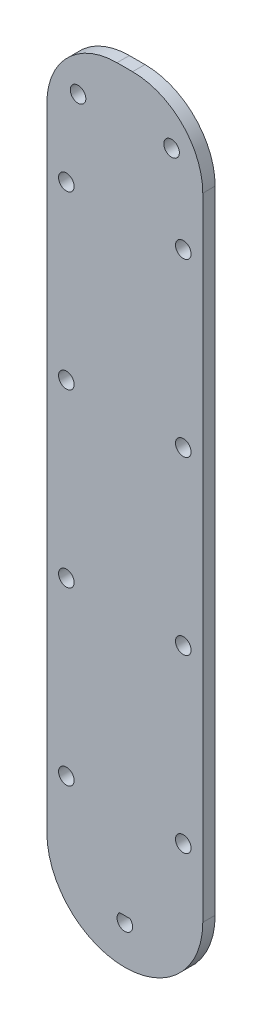
ISO-10303-21;
HEADER;
FILE_DESCRIPTION(('STEP AP214'),'2;1');
FILE_NAME('part.step','',(''),(''),'','','');
FILE_SCHEMA(('AUTOMOTIVE_DESIGN { 1 0 10303 214 1 1 1 1 }'));
ENDSEC;
DATA;
#1=APPLICATION_CONTEXT('core data for automotive mechanical design processes');
#2=APPLICATION_PROTOCOL_DEFINITION('international standard','automotive_design',2000,#1);
#3=PRODUCT_CONTEXT('',#1,'mechanical');
#4=PRODUCT('Part','Part','',(#3));
#5=PRODUCT_RELATED_PRODUCT_CATEGORY('part','',(#4));
#6=PRODUCT_DEFINITION_FORMATION('','',#4);
#7=PRODUCT_DEFINITION_CONTEXT('part definition',#1,'design');
#8=PRODUCT_DEFINITION('design','',#6,#7);
#9=PRODUCT_DEFINITION_SHAPE('','',#8);
#10=(LENGTH_UNIT() NAMED_UNIT(*) SI_UNIT(.MILLI.,.METRE.));
#11=(NAMED_UNIT(*) PLANE_ANGLE_UNIT() SI_UNIT($,.RADIAN.));
#12=(NAMED_UNIT(*) SI_UNIT($,.STERADIAN.) SOLID_ANGLE_UNIT());
#13=UNCERTAINTY_MEASURE_WITH_UNIT(LENGTH_MEASURE(1.E-05),#10,'distance_accuracy_value','');
#14=(GEOMETRIC_REPRESENTATION_CONTEXT(3) GLOBAL_UNCERTAINTY_ASSIGNED_CONTEXT((#13)) GLOBAL_UNIT_ASSIGNED_CONTEXT((#10,
#11,#12)) REPRESENTATION_CONTEXT('',''));
#15=CARTESIAN_POINT('',(0.,0.,0.));
#16=DIRECTION('',(0.,0.,1.));
#17=DIRECTION('',(1.,0.,0.));
#18=AXIS2_PLACEMENT_3D('',#15,#16,#17);
#19=CARTESIAN_POINT('',(20.,-100.,3.175));
#20=DIRECTION('',(-1.,0.,0.));
#21=DIRECTION('',(0.,0.,1.));
#22=AXIS2_PLACEMENT_3D('',#19,#20,#21);
#23=PLANE('',#22);
#24=DIRECTION('',(0.,1.,0.));
#25=VECTOR('',#24,1.);
#26=CARTESIAN_POINT('',(20.,-100.,0.));
#27=LINE('',#26,#25);
#28=CARTESIAN_POINT('',(20.,-80.,0.));
#29=VERTEX_POINT('',#28);
#30=CARTESIAN_POINT('',(20.,82.,0.));
#31=VERTEX_POINT('',#30);
#32=EDGE_CURVE('E142',#29,#31,#27,.T.);
#33=ORIENTED_EDGE('',*,*,#32,.T.);
#34=DIRECTION('',(0.,0.,-1.));
#35=VECTOR('',#34,1.);
#36=CARTESIAN_POINT('',(20.,82.,3.175));
#37=LINE('',#36,#35);
#38=CARTESIAN_POINT('',(20.,82.,3.175));
#39=VERTEX_POINT('',#38);
#40=EDGE_CURVE('E59',#31,#39,#37,.F.);
#41=ORIENTED_EDGE('',*,*,#40,.T.);
#42=DIRECTION('',(0.,1.,0.));
#43=VECTOR('',#42,1.);
#44=CARTESIAN_POINT('',(20.,-100.,3.175));
#45=LINE('',#44,#43);
#46=CARTESIAN_POINT('',(20.,-80.,3.175));
#47=VERTEX_POINT('',#46);
#48=EDGE_CURVE('E143',#47,#39,#45,.T.);
#49=ORIENTED_EDGE('',*,*,#48,.F.);
#50=DIRECTION('',(0.,0.,-1.));
#51=VECTOR('',#50,1.);
#52=CARTESIAN_POINT('',(20.,-80.,3.175));
#53=LINE('',#52,#51);
#54=EDGE_CURVE('E150',#47,#29,#53,.T.);
#55=ORIENTED_EDGE('',*,*,#54,.T.);
#56=EDGE_LOOP('',(#33,#41,#49,#55));
#57=FACE_BOUND('',#56,.T.);
#58=ADVANCED_FACE('F36',(#57),#23,.F.);
#59=CARTESIAN_POINT('',(-20.,100.,3.175));
#60=DIRECTION('',(0.,-1.,0.));
#61=DIRECTION('',(0.,0.,-1.));
#62=AXIS2_PLACEMENT_3D('',#59,#60,#61);
#63=PLANE('',#62);
#64=DIRECTION('',(-1.,0.,0.));
#65=VECTOR('',#64,1.);
#66=CARTESIAN_POINT('',(-20.,100.,3.175));
#67=LINE('',#66,#65);
#68=CARTESIAN_POINT('',(2.00000000000001,100.,3.175));
#69=VERTEX_POINT('',#68);
#70=CARTESIAN_POINT('',(-2.,100.,3.175));
#71=VERTEX_POINT('',#70);
#72=EDGE_CURVE('E145',#69,#71,#67,.T.);
#73=ORIENTED_EDGE('',*,*,#72,.F.);
#74=DIRECTION('',(0.,0.,-1.));
#75=VECTOR('',#74,1.);
#76=CARTESIAN_POINT('',(2.00000000000001,100.,3.175));
#77=LINE('',#76,#75);
#78=CARTESIAN_POINT('',(2.00000000000001,100.,0.));
#79=VERTEX_POINT('',#78);
#80=EDGE_CURVE('E172',#69,#79,#77,.T.);
#81=ORIENTED_EDGE('',*,*,#80,.T.);
#82=DIRECTION('',(-1.,0.,0.));
#83=VECTOR('',#82,1.);
#84=CARTESIAN_POINT('',(-20.,100.,0.));
#85=LINE('',#84,#83);
#86=CARTESIAN_POINT('',(-2.,100.,0.));
#87=VERTEX_POINT('',#86);
#88=EDGE_CURVE('E152',#79,#87,#85,.T.);
#89=ORIENTED_EDGE('',*,*,#88,.T.);
#90=DIRECTION('',(0.,0.,-1.));
#91=VECTOR('',#90,1.);
#92=CARTESIAN_POINT('',(-2.,100.,3.175));
#93=LINE('',#92,#91);
#94=EDGE_CURVE('E169',#87,#71,#93,.F.);
#95=ORIENTED_EDGE('',*,*,#94,.T.);
#96=EDGE_LOOP('',(#73,#81,#89,#95));
#97=FACE_BOUND('',#96,.T.);
#98=ADVANCED_FACE('F186',(#97),#63,.F.);
#99=CARTESIAN_POINT('',(-20.,-100.,3.175));
#100=DIRECTION('',(1.,0.,0.));
#101=DIRECTION('',(0.,0.,-1.));
#102=AXIS2_PLACEMENT_3D('',#99,#100,#101);
#103=PLANE('',#102);
#104=DIRECTION('',(0.,-1.,0.));
#105=VECTOR('',#104,1.);
#106=CARTESIAN_POINT('',(-20.,-100.,3.175));
#107=LINE('',#106,#105);
#108=CARTESIAN_POINT('',(-20.,82.,3.175));
#109=VERTEX_POINT('',#108);
#110=CARTESIAN_POINT('',(-20.,-80.,3.175));
#111=VERTEX_POINT('',#110);
#112=EDGE_CURVE('E148',#109,#111,#107,.T.);
#113=ORIENTED_EDGE('',*,*,#112,.F.);
#114=DIRECTION('',(0.,0.,-1.));
#115=VECTOR('',#114,1.);
#116=CARTESIAN_POINT('',(-20.,82.,3.175));
#117=LINE('',#116,#115);
#118=CARTESIAN_POINT('',(-20.,82.,0.));
#119=VERTEX_POINT('',#118);
#120=EDGE_CURVE('E11',#109,#119,#117,.T.);
#121=ORIENTED_EDGE('',*,*,#120,.T.);
#122=DIRECTION('',(0.,-1.,0.));
#123=VECTOR('',#122,1.);
#124=CARTESIAN_POINT('',(-20.,-100.,0.));
#125=LINE('',#124,#123);
#126=CARTESIAN_POINT('',(-20.,-80.,0.));
#127=VERTEX_POINT('',#126);
#128=EDGE_CURVE('E146',#119,#127,#125,.T.);
#129=ORIENTED_EDGE('',*,*,#128,.T.);
#130=DIRECTION('',(0.,0.,-1.));
#131=VECTOR('',#130,1.);
#132=CARTESIAN_POINT('',(-20.,-80.,3.175));
#133=LINE('',#132,#131);
#134=EDGE_CURVE('E167',#127,#111,#133,.F.);
#135=ORIENTED_EDGE('',*,*,#134,.T.);
#136=EDGE_LOOP('',(#113,#121,#129,#135));
#137=FACE_BOUND('',#136,.T.);
#138=ADVANCED_FACE('F203',(#137),#103,.F.);
#139=CARTESIAN_POINT('',(0.,0.,3.175));
#140=DIRECTION('',(0.,0.,-1.));
#141=DIRECTION('',(-1.,0.,0.));
#142=AXIS2_PLACEMENT_3D('',#139,#140,#141);
#143=PLANE('',#142);
#144=CARTESIAN_POINT('',(-12.,88.,3.175));
#145=DIRECTION('',(0.,0.,1.));
#146=DIRECTION('',(1.,0.,0.));
#147=AXIS2_PLACEMENT_3D('',#144,#145,#146);
#148=CIRCLE('',#147,2.);
#149=CARTESIAN_POINT('',(-10.,88.,3.175));
#150=VERTEX_POINT('',#149);
#151=EDGE_CURVE('E400',#150,#150,#148,.T.);
#152=ORIENTED_EDGE('',*,*,#151,.F.);
#153=EDGE_LOOP('',(#152));
#154=FACE_BOUND('',#153,.T.);
#155=CARTESIAN_POINT('',(12.,88.,3.175));
#156=DIRECTION('',(0.,0.,1.));
#157=DIRECTION('',(1.,0.,0.));
#158=AXIS2_PLACEMENT_3D('',#155,#156,#157);
#159=CIRCLE('',#158,2.);
#160=CARTESIAN_POINT('',(14.,88.,3.175));
#161=VERTEX_POINT('',#160);
#162=EDGE_CURVE('E406',#161,#161,#159,.T.);
#163=ORIENTED_EDGE('',*,*,#162,.F.);
#164=EDGE_LOOP('',(#163));
#165=FACE_BOUND('',#164,.T.);
#166=CARTESIAN_POINT('',(15.,-21.,3.175));
#167=DIRECTION('',(0.,0.,1.));
#168=DIRECTION('',(1.,0.,0.));
#169=AXIS2_PLACEMENT_3D('',#166,#167,#168);
#170=CIRCLE('',#169,2.00000000000001);
#171=CARTESIAN_POINT('',(17.,-21.,3.175));
#172=VERTEX_POINT('',#171);
#173=EDGE_CURVE('E432',#172,#172,#170,.T.);
#174=ORIENTED_EDGE('',*,*,#173,.F.);
#175=EDGE_LOOP('',(#174));
#176=FACE_BOUND('',#175,.T.);
#177=CARTESIAN_POINT('',(15.,23.,3.175));
#178=DIRECTION('',(0.,0.,1.));
#179=DIRECTION('',(1.,0.,0.));
#180=AXIS2_PLACEMENT_3D('',#177,#178,#179);
#181=CIRCLE('',#180,2.00000000000001);
#182=CARTESIAN_POINT('',(17.,23.,3.175));
#183=VERTEX_POINT('',#182);
#184=EDGE_CURVE('E438',#183,#183,#181,.T.);
#185=ORIENTED_EDGE('',*,*,#184,.F.);
#186=EDGE_LOOP('',(#185));
#187=FACE_BOUND('',#186,.T.);
#188=CARTESIAN_POINT('',(15.,-65.,3.175));
#189=DIRECTION('',(0.,0.,1.));
#190=DIRECTION('',(1.,0.,0.));
#191=AXIS2_PLACEMENT_3D('',#188,#189,#190);
#192=CIRCLE('',#191,2.00000000000001);
#193=CARTESIAN_POINT('',(17.,-65.,3.175));
#194=VERTEX_POINT('',#193);
#195=EDGE_CURVE('E444',#194,#194,#192,.T.);
#196=ORIENTED_EDGE('',*,*,#195,.F.);
#197=EDGE_LOOP('',(#196));
#198=FACE_BOUND('',#197,.T.);
#199=CARTESIAN_POINT('',(-15.,-65.,3.175));
#200=DIRECTION('',(0.,0.,1.));
#201=DIRECTION('',(-1.,0.,0.));
#202=AXIS2_PLACEMENT_3D('',#199,#200,#201);
#203=CIRCLE('',#202,2.00000000000001);
#204=CARTESIAN_POINT('',(-17.,-65.,3.175));
#205=VERTEX_POINT('',#204);
#206=EDGE_CURVE('E414',#205,#205,#203,.T.);
#207=ORIENTED_EDGE('',*,*,#206,.F.);
#208=EDGE_LOOP('',(#207));
#209=FACE_BOUND('',#208,.T.);
#210=CARTESIAN_POINT('',(-15.,23.,3.175));
#211=DIRECTION('',(0.,0.,1.));
#212=DIRECTION('',(-1.,0.,0.));
#213=AXIS2_PLACEMENT_3D('',#210,#211,#212);
#214=CIRCLE('',#213,2.00000000000001);
#215=CARTESIAN_POINT('',(-17.,23.,3.175));
#216=VERTEX_POINT('',#215);
#217=EDGE_CURVE('E415',#216,#216,#214,.T.);
#218=ORIENTED_EDGE('',*,*,#217,.F.);
#219=EDGE_LOOP('',(#218));
#220=FACE_BOUND('',#219,.T.);
#221=CARTESIAN_POINT('',(-15.,-21.,3.175));
#222=DIRECTION('',(0.,0.,1.));
#223=DIRECTION('',(-1.,0.,0.));
#224=AXIS2_PLACEMENT_3D('',#221,#222,#223);
#225=CIRCLE('',#224,2.00000000000001);
#226=CARTESIAN_POINT('',(-17.,-21.,3.175));
#227=VERTEX_POINT('',#226);
#228=EDGE_CURVE('E421',#227,#227,#225,.T.);
#229=ORIENTED_EDGE('',*,*,#228,.F.);
#230=EDGE_LOOP('',(#229));
#231=FACE_BOUND('',#230,.T.);
#232=CARTESIAN_POINT('',(-15.,67.,3.175));
#233=DIRECTION('',(0.,0.,1.));
#234=DIRECTION('',(-1.,0.,0.));
#235=AXIS2_PLACEMENT_3D('',#232,#233,#234);
#236=CIRCLE('',#235,2.00000000000001);
#237=CARTESIAN_POINT('',(-17.,67.,3.175));
#238=VERTEX_POINT('',#237);
#239=EDGE_CURVE('E403',#238,#238,#236,.T.);
#240=ORIENTED_EDGE('',*,*,#239,.F.);
#241=EDGE_LOOP('',(#240));
#242=FACE_BOUND('',#241,.T.);
#243=CARTESIAN_POINT('',(15.,67.,3.175));
#244=DIRECTION('',(0.,0.,1.));
#245=DIRECTION('',(1.,0.,0.));
#246=AXIS2_PLACEMENT_3D('',#243,#244,#245);
#247=CIRCLE('',#246,2.00000000000001);
#248=CARTESIAN_POINT('',(17.,67.,3.175));
#249=VERTEX_POINT('',#248);
#250=EDGE_CURVE('E136',#249,#249,#247,.T.);
#251=ORIENTED_EDGE('',*,*,#250,.F.);
#252=EDGE_LOOP('',(#251));
#253=FACE_BOUND('',#252,.T.);
#254=DIRECTION('',(1.,0.,0.));
#255=VECTOR('',#254,1.);
#256=CARTESIAN_POINT('',(0.,-88.5018761733422,3.175));
#257=LINE('',#256,#255);
#258=CARTESIAN_POINT('',(-1.325,-88.5018761733422,3.175));
#259=VERTEX_POINT('',#258);
#260=CARTESIAN_POINT('',(1.325,-88.5018761733422,3.175));
#261=VERTEX_POINT('',#260);
#262=EDGE_CURVE('E120',#259,#261,#257,.T.);
#263=ORIENTED_EDGE('',*,*,#262,.T.);
#264=CARTESIAN_POINT('',(0.,-90.,3.175));
#265=DIRECTION('',(0.,0.,-1.));
#266=DIRECTION('',(-1.,0.,0.));
#267=AXIS2_PLACEMENT_3D('',#264,#265,#266);
#268=CIRCLE('',#267,1.99999999999999);
#269=EDGE_CURVE('E117',#261,#259,#268,.T.);
#270=ORIENTED_EDGE('',*,*,#269,.T.);
#271=EDGE_LOOP('',(#263,#270));
#272=FACE_BOUND('',#271,.T.);
#273=ORIENTED_EDGE('',*,*,#48,.T.);
#274=CARTESIAN_POINT('',(2.00000000000001,82.,3.175));
#275=DIRECTION('',(0.,0.,-1.));
#276=DIRECTION('',(-1.,0.,0.));
#277=AXIS2_PLACEMENT_3D('',#274,#275,#276);
#278=CIRCLE('',#277,18.);
#279=EDGE_CURVE('E44',#39,#69,#278,.F.);
#280=ORIENTED_EDGE('',*,*,#279,.T.);
#281=ORIENTED_EDGE('',*,*,#72,.T.);
#282=CARTESIAN_POINT('',(-2.,82.,3.175));
#283=DIRECTION('',(0.,0.,-1.));
#284=DIRECTION('',(-1.,0.,0.));
#285=AXIS2_PLACEMENT_3D('',#282,#283,#284);
#286=CIRCLE('',#285,18.);
#287=EDGE_CURVE('E51',#71,#109,#286,.F.);
#288=ORIENTED_EDGE('',*,*,#287,.T.);
#289=ORIENTED_EDGE('',*,*,#112,.T.);
#290=CARTESIAN_POINT('',(0.,-80.,3.175));
#291=DIRECTION('',(0.,0.,-1.));
#292=DIRECTION('',(-1.,0.,0.));
#293=AXIS2_PLACEMENT_3D('',#290,#291,#292);
#294=CIRCLE('',#293,20.);
#295=CARTESIAN_POINT('',(0.,-100.,3.175));
#296=VERTEX_POINT('',#295);
#297=EDGE_CURVE('E163',#111,#296,#294,.F.);
#298=ORIENTED_EDGE('',*,*,#297,.T.);
#299=CARTESIAN_POINT('',(0.,-80.,3.175));
#300=DIRECTION('',(0.,0.,-1.));
#301=DIRECTION('',(-1.,0.,0.));
#302=AXIS2_PLACEMENT_3D('',#299,#300,#301);
#303=CIRCLE('',#302,20.);
#304=EDGE_CURVE('E165',#296,#47,#303,.F.);
#305=ORIENTED_EDGE('',*,*,#304,.T.);
#306=EDGE_LOOP('',(#273,#280,#281,#288,#289,#298,#305));
#307=FACE_BOUND('',#306,.T.);
#308=ADVANCED_FACE('F182',(#154,#165,#176,#187,#198,#209,#220,#231,#242,#253,#272,#307),#143,.F.);
#309=CARTESIAN_POINT('',(0.,0.,0.));
#310=DIRECTION('',(0.,0.,-1.));
#311=DIRECTION('',(-1.,0.,0.));
#312=AXIS2_PLACEMENT_3D('',#309,#310,#311);
#313=PLANE('',#312);
#314=CARTESIAN_POINT('',(-12.,88.,0.));
#315=DIRECTION('',(0.,0.,1.));
#316=DIRECTION('',(1.,0.,0.));
#317=AXIS2_PLACEMENT_3D('',#314,#315,#316);
#318=CIRCLE('',#317,2.);
#319=CARTESIAN_POINT('',(-10.,88.,0.));
#320=VERTEX_POINT('',#319);
#321=EDGE_CURVE('E397',#320,#320,#318,.T.);
#322=ORIENTED_EDGE('',*,*,#321,.T.);
#323=EDGE_LOOP('',(#322));
#324=FACE_BOUND('',#323,.T.);
#325=CARTESIAN_POINT('',(12.,88.,0.));
#326=DIRECTION('',(0.,0.,1.));
#327=DIRECTION('',(1.,0.,0.));
#328=AXIS2_PLACEMENT_3D('',#325,#326,#327);
#329=CIRCLE('',#328,2.);
#330=CARTESIAN_POINT('',(14.,88.,0.));
#331=VERTEX_POINT('',#330);
#332=EDGE_CURVE('E401',#331,#331,#329,.T.);
#333=ORIENTED_EDGE('',*,*,#332,.T.);
#334=EDGE_LOOP('',(#333));
#335=FACE_BOUND('',#334,.T.);
#336=CARTESIAN_POINT('',(15.,-21.,0.));
#337=DIRECTION('',(0.,0.,1.));
#338=DIRECTION('',(1.,0.,0.));
#339=AXIS2_PLACEMENT_3D('',#336,#337,#338);
#340=CIRCLE('',#339,2.00000000000001);
#341=CARTESIAN_POINT('',(17.,-21.,0.));
#342=VERTEX_POINT('',#341);
#343=EDGE_CURVE('E429',#342,#342,#340,.T.);
#344=ORIENTED_EDGE('',*,*,#343,.T.);
#345=EDGE_LOOP('',(#344));
#346=FACE_BOUND('',#345,.T.);
#347=CARTESIAN_POINT('',(15.,23.,0.));
#348=DIRECTION('',(0.,0.,1.));
#349=DIRECTION('',(1.,0.,0.));
#350=AXIS2_PLACEMENT_3D('',#347,#348,#349);
#351=CIRCLE('',#350,2.00000000000001);
#352=CARTESIAN_POINT('',(17.,23.,0.));
#353=VERTEX_POINT('',#352);
#354=EDGE_CURVE('E435',#353,#353,#351,.T.);
#355=ORIENTED_EDGE('',*,*,#354,.T.);
#356=EDGE_LOOP('',(#355));
#357=FACE_BOUND('',#356,.T.);
#358=CARTESIAN_POINT('',(15.,-65.,0.));
#359=DIRECTION('',(0.,0.,1.));
#360=DIRECTION('',(1.,0.,0.));
#361=AXIS2_PLACEMENT_3D('',#358,#359,#360);
#362=CIRCLE('',#361,2.00000000000001);
#363=CARTESIAN_POINT('',(17.,-65.,0.));
#364=VERTEX_POINT('',#363);
#365=EDGE_CURVE('E441',#364,#364,#362,.T.);
#366=ORIENTED_EDGE('',*,*,#365,.T.);
#367=EDGE_LOOP('',(#366));
#368=FACE_BOUND('',#367,.T.);
#369=CARTESIAN_POINT('',(-15.,-65.,0.));
#370=DIRECTION('',(0.,0.,1.));
#371=DIRECTION('',(-1.,0.,0.));
#372=AXIS2_PLACEMENT_3D('',#369,#370,#371);
#373=CIRCLE('',#372,2.00000000000001);
#374=CARTESIAN_POINT('',(-17.,-65.,0.));
#375=VERTEX_POINT('',#374);
#376=EDGE_CURVE('E447',#375,#375,#373,.T.);
#377=ORIENTED_EDGE('',*,*,#376,.T.);
#378=EDGE_LOOP('',(#377));
#379=FACE_BOUND('',#378,.T.);
#380=CARTESIAN_POINT('',(-15.,23.,0.));
#381=DIRECTION('',(0.,0.,1.));
#382=DIRECTION('',(-1.,0.,0.));
#383=AXIS2_PLACEMENT_3D('',#380,#381,#382);
#384=CIRCLE('',#383,2.00000000000001);
#385=CARTESIAN_POINT('',(-17.,23.,0.));
#386=VERTEX_POINT('',#385);
#387=EDGE_CURVE('E411',#386,#386,#384,.T.);
#388=ORIENTED_EDGE('',*,*,#387,.T.);
#389=EDGE_LOOP('',(#388));
#390=FACE_BOUND('',#389,.T.);
#391=CARTESIAN_POINT('',(-15.,-21.,0.));
#392=DIRECTION('',(0.,0.,1.));
#393=DIRECTION('',(-1.,0.,0.));
#394=AXIS2_PLACEMENT_3D('',#391,#392,#393);
#395=CIRCLE('',#394,2.00000000000001);
#396=CARTESIAN_POINT('',(-17.,-21.,0.));
#397=VERTEX_POINT('',#396);
#398=EDGE_CURVE('E418',#397,#397,#395,.T.);
#399=ORIENTED_EDGE('',*,*,#398,.T.);
#400=EDGE_LOOP('',(#399));
#401=FACE_BOUND('',#400,.T.);
#402=CARTESIAN_POINT('',(-15.,67.,0.));
#403=DIRECTION('',(0.,0.,1.));
#404=DIRECTION('',(-1.,0.,0.));
#405=AXIS2_PLACEMENT_3D('',#402,#403,#404);
#406=CIRCLE('',#405,2.00000000000001);
#407=CARTESIAN_POINT('',(-17.,67.,0.));
#408=VERTEX_POINT('',#407);
#409=EDGE_CURVE('E424',#408,#408,#406,.T.);
#410=ORIENTED_EDGE('',*,*,#409,.T.);
#411=EDGE_LOOP('',(#410));
#412=FACE_BOUND('',#411,.T.);
#413=CARTESIAN_POINT('',(15.,67.,0.));
#414=DIRECTION('',(0.,0.,1.));
#415=DIRECTION('',(1.,0.,0.));
#416=AXIS2_PLACEMENT_3D('',#413,#414,#415);
#417=CIRCLE('',#416,2.00000000000001);
#418=CARTESIAN_POINT('',(17.,67.,0.));
#419=VERTEX_POINT('',#418);
#420=EDGE_CURVE('E133',#419,#419,#417,.T.);
#421=ORIENTED_EDGE('',*,*,#420,.T.);
#422=EDGE_LOOP('',(#421));
#423=FACE_BOUND('',#422,.T.);
#424=CARTESIAN_POINT('',(0.,-90.,0.));
#425=DIRECTION('',(0.,0.,-1.));
#426=DIRECTION('',(-1.,0.,0.));
#427=AXIS2_PLACEMENT_3D('',#424,#425,#426);
#428=CIRCLE('',#427,1.99999999999999);
#429=CARTESIAN_POINT('',(1.325,-88.5018761733422,0.));
#430=VERTEX_POINT('',#429);
#431=CARTESIAN_POINT('',(-1.325,-88.5018761733422,0.));
#432=VERTEX_POINT('',#431);
#433=EDGE_CURVE('E114',#430,#432,#428,.T.);
#434=ORIENTED_EDGE('',*,*,#433,.F.);
#435=DIRECTION('',(1.,0.,0.));
#436=VECTOR('',#435,1.);
#437=CARTESIAN_POINT('',(-1.325,-88.5018761733422,0.));
#438=LINE('',#437,#436);
#439=EDGE_CURVE('E124',#432,#430,#438,.T.);
#440=ORIENTED_EDGE('',*,*,#439,.F.);
#441=EDGE_LOOP('',(#434,#440));
#442=FACE_BOUND('',#441,.T.);
#443=ORIENTED_EDGE('',*,*,#88,.F.);
#444=CARTESIAN_POINT('',(2.00000000000001,82.,0.));
#445=DIRECTION('',(0.,0.,-1.));
#446=DIRECTION('',(-1.,0.,0.));
#447=AXIS2_PLACEMENT_3D('',#444,#445,#446);
#448=CIRCLE('',#447,18.);
#449=EDGE_CURVE('E177',#79,#31,#448,.T.);
#450=ORIENTED_EDGE('',*,*,#449,.T.);
#451=ORIENTED_EDGE('',*,*,#32,.F.);
#452=CARTESIAN_POINT('',(0.,-80.,0.));
#453=DIRECTION('',(0.,0.,-1.));
#454=DIRECTION('',(-1.,0.,0.));
#455=AXIS2_PLACEMENT_3D('',#452,#453,#454);
#456=CIRCLE('',#455,20.);
#457=CARTESIAN_POINT('',(0.,-100.,0.));
#458=VERTEX_POINT('',#457);
#459=EDGE_CURVE('E161',#29,#458,#456,.T.);
#460=ORIENTED_EDGE('',*,*,#459,.T.);
#461=CARTESIAN_POINT('',(0.,-80.,0.));
#462=DIRECTION('',(0.,0.,-1.));
#463=DIRECTION('',(-1.,0.,0.));
#464=AXIS2_PLACEMENT_3D('',#461,#462,#463);
#465=CIRCLE('',#464,20.);
#466=EDGE_CURVE('E158',#458,#127,#465,.T.);
#467=ORIENTED_EDGE('',*,*,#466,.T.);
#468=ORIENTED_EDGE('',*,*,#128,.F.);
#469=CARTESIAN_POINT('',(-2.,82.,0.));
#470=DIRECTION('',(0.,0.,-1.));
#471=DIRECTION('',(-1.,0.,0.));
#472=AXIS2_PLACEMENT_3D('',#469,#470,#471);
#473=CIRCLE('',#472,18.);
#474=EDGE_CURVE('E175',#119,#87,#473,.T.);
#475=ORIENTED_EDGE('',*,*,#474,.T.);
#476=EDGE_LOOP('',(#443,#450,#451,#460,#467,#468,#475));
#477=FACE_BOUND('',#476,.T.);
#478=ADVANCED_FACE('F128',(#324,#335,#346,#357,#368,#379,#390,#401,#412,#423,#442,#477),#313,.T.);
#479=CARTESIAN_POINT('',(0.,-90.,10.));
#480=DIRECTION('',(0.,0.,-1.));
#481=DIRECTION('',(-1.,0.,0.));
#482=AXIS2_PLACEMENT_3D('',#479,#480,#481);
#483=CYLINDRICAL_SURFACE('',#482,1.99999999999999);
#484=DIRECTION('',(0.,0.,-1.));
#485=VECTOR('',#484,1.);
#486=CARTESIAN_POINT('',(1.325,-88.5018761733422,10.));
#487=LINE('',#486,#485);
#488=EDGE_CURVE('E109',#261,#430,#487,.T.);
#489=ORIENTED_EDGE('',*,*,#488,.T.);
#490=ORIENTED_EDGE('',*,*,#433,.T.);
#491=DIRECTION('',(0.,0.,-1.));
#492=VECTOR('',#491,1.);
#493=CARTESIAN_POINT('',(-1.325,-88.5018761733422,10.));
#494=LINE('',#493,#492);
#495=EDGE_CURVE('E121',#259,#432,#494,.T.);
#496=ORIENTED_EDGE('',*,*,#495,.F.);
#497=ORIENTED_EDGE('',*,*,#269,.F.);
#498=EDGE_LOOP('',(#489,#490,#496,#497));
#499=FACE_BOUND('',#498,.T.);
#500=ADVANCED_FACE('F111',(#499),#483,.F.);
#501=CARTESIAN_POINT('',(-1.325,-88.5018761733422,10.));
#502=DIRECTION('',(0.,1.,0.));
#503=DIRECTION('',(0.,0.,1.));
#504=AXIS2_PLACEMENT_3D('',#501,#502,#503);
#505=PLANE('',#504);
#506=ORIENTED_EDGE('',*,*,#495,.T.);
#507=ORIENTED_EDGE('',*,*,#439,.T.);
#508=ORIENTED_EDGE('',*,*,#488,.F.);
#509=ORIENTED_EDGE('',*,*,#262,.F.);
#510=EDGE_LOOP('',(#506,#507,#508,#509));
#511=FACE_BOUND('',#510,.T.);
#512=ADVANCED_FACE('F125',(#511),#505,.F.);
#513=CARTESIAN_POINT('',(0.,-80.,3.175));
#514=DIRECTION('',(0.,0.,-1.));
#515=DIRECTION('',(-1.,0.,0.));
#516=AXIS2_PLACEMENT_3D('',#513,#514,#515);
#517=CYLINDRICAL_SURFACE('',#516,20.);
#518=DIRECTION('',(0.,0.,-1.));
#519=VECTOR('',#518,1.);
#520=CARTESIAN_POINT('',(0.,-100.,3.175));
#521=LINE('',#520,#519);
#522=EDGE_CURVE('E130',#296,#458,#521,.T.);
#523=ORIENTED_EDGE('',*,*,#522,.F.);
#524=ORIENTED_EDGE('',*,*,#297,.F.);
#525=ORIENTED_EDGE('',*,*,#134,.F.);
#526=ORIENTED_EDGE('',*,*,#466,.F.);
#527=EDGE_LOOP('',(#523,#524,#525,#526));
#528=FACE_BOUND('',#527,.T.);
#529=ADVANCED_FACE('F200',(#528),#517,.T.);
#530=CARTESIAN_POINT('',(0.,-80.,3.175));
#531=DIRECTION('',(0.,0.,-1.));
#532=DIRECTION('',(-1.,0.,0.));
#533=AXIS2_PLACEMENT_3D('',#530,#531,#532);
#534=CYLINDRICAL_SURFACE('',#533,20.);
#535=ORIENTED_EDGE('',*,*,#304,.F.);
#536=ORIENTED_EDGE('',*,*,#522,.T.);
#537=ORIENTED_EDGE('',*,*,#459,.F.);
#538=ORIENTED_EDGE('',*,*,#54,.F.);
#539=EDGE_LOOP('',(#535,#536,#537,#538));
#540=FACE_BOUND('',#539,.T.);
#541=ADVANCED_FACE('F194',(#540),#534,.T.);
#542=CARTESIAN_POINT('',(2.00000000000001,82.,3.175));
#543=DIRECTION('',(0.,0.,-1.));
#544=DIRECTION('',(-1.,0.,0.));
#545=AXIS2_PLACEMENT_3D('',#542,#543,#544);
#546=CYLINDRICAL_SURFACE('',#545,18.);
#547=ORIENTED_EDGE('',*,*,#279,.F.);
#548=ORIENTED_EDGE('',*,*,#40,.F.);
#549=ORIENTED_EDGE('',*,*,#449,.F.);
#550=ORIENTED_EDGE('',*,*,#80,.F.);
#551=EDGE_LOOP('',(#547,#548,#549,#550));
#552=FACE_BOUND('',#551,.T.);
#553=ADVANCED_FACE('F189',(#552),#546,.T.);
#554=CARTESIAN_POINT('',(-2.,82.,3.175));
#555=DIRECTION('',(0.,0.,-1.));
#556=DIRECTION('',(-1.,0.,0.));
#557=AXIS2_PLACEMENT_3D('',#554,#555,#556);
#558=CYLINDRICAL_SURFACE('',#557,18.);
#559=ORIENTED_EDGE('',*,*,#287,.F.);
#560=ORIENTED_EDGE('',*,*,#94,.F.);
#561=ORIENTED_EDGE('',*,*,#474,.F.);
#562=ORIENTED_EDGE('',*,*,#120,.F.);
#563=EDGE_LOOP('',(#559,#560,#561,#562));
#564=FACE_BOUND('',#563,.T.);
#565=ADVANCED_FACE('F38',(#564),#558,.T.);
#566=CARTESIAN_POINT('',(15.,67.,0.));
#567=DIRECTION('',(0.,0.,1.));
#568=DIRECTION('',(1.,0.,0.));
#569=AXIS2_PLACEMENT_3D('',#566,#567,#568);
#570=CYLINDRICAL_SURFACE('',#569,2.00000000000001);
#571=ORIENTED_EDGE('',*,*,#420,.F.);
#572=EDGE_LOOP('',(#571));
#573=FACE_BOUND('',#572,.T.);
#574=ORIENTED_EDGE('',*,*,#250,.T.);
#575=EDGE_LOOP('',(#574));
#576=FACE_BOUND('',#575,.T.);
#577=ADVANCED_FACE('F207',(#573,#576),#570,.F.);
#578=CARTESIAN_POINT('',(-15.,67.,0.));
#579=DIRECTION('',(0.,0.,1.));
#580=DIRECTION('',(1.,0.,0.));
#581=AXIS2_PLACEMENT_3D('',#578,#579,#580);
#582=CYLINDRICAL_SURFACE('',#581,2.00000000000001);
#583=ORIENTED_EDGE('',*,*,#409,.F.);
#584=EDGE_LOOP('',(#583));
#585=FACE_BOUND('',#584,.T.);
#586=ORIENTED_EDGE('',*,*,#239,.T.);
#587=EDGE_LOOP('',(#586));
#588=FACE_BOUND('',#587,.T.);
#589=ADVANCED_FACE('F212',(#585,#588),#582,.F.);
#590=CARTESIAN_POINT('',(-15.,-21.,0.));
#591=DIRECTION('',(0.,0.,1.));
#592=DIRECTION('',(1.,0.,0.));
#593=AXIS2_PLACEMENT_3D('',#590,#591,#592);
#594=CYLINDRICAL_SURFACE('',#593,2.00000000000001);
#595=ORIENTED_EDGE('',*,*,#398,.F.);
#596=EDGE_LOOP('',(#595));
#597=FACE_BOUND('',#596,.T.);
#598=ORIENTED_EDGE('',*,*,#228,.T.);
#599=EDGE_LOOP('',(#598));
#600=FACE_BOUND('',#599,.T.);
#601=ADVANCED_FACE('F313',(#597,#600),#594,.F.);
#602=CARTESIAN_POINT('',(-15.,23.,0.));
#603=DIRECTION('',(0.,0.,1.));
#604=DIRECTION('',(1.,0.,0.));
#605=AXIS2_PLACEMENT_3D('',#602,#603,#604);
#606=CYLINDRICAL_SURFACE('',#605,2.00000000000001);
#607=ORIENTED_EDGE('',*,*,#387,.F.);
#608=EDGE_LOOP('',(#607));
#609=FACE_BOUND('',#608,.T.);
#610=ORIENTED_EDGE('',*,*,#217,.T.);
#611=EDGE_LOOP('',(#610));
#612=FACE_BOUND('',#611,.T.);
#613=ADVANCED_FACE('F323',(#609,#612),#606,.F.);
#614=CARTESIAN_POINT('',(-15.,-65.,0.));
#615=DIRECTION('',(0.,0.,1.));
#616=DIRECTION('',(1.,0.,0.));
#617=AXIS2_PLACEMENT_3D('',#614,#615,#616);
#618=CYLINDRICAL_SURFACE('',#617,2.00000000000001);
#619=ORIENTED_EDGE('',*,*,#376,.F.);
#620=EDGE_LOOP('',(#619));
#621=FACE_BOUND('',#620,.T.);
#622=ORIENTED_EDGE('',*,*,#206,.T.);
#623=EDGE_LOOP('',(#622));
#624=FACE_BOUND('',#623,.T.);
#625=ADVANCED_FACE('F333',(#621,#624),#618,.F.);
#626=CARTESIAN_POINT('',(15.,-65.,0.));
#627=DIRECTION('',(0.,0.,1.));
#628=DIRECTION('',(1.,0.,0.));
#629=AXIS2_PLACEMENT_3D('',#626,#627,#628);
#630=CYLINDRICAL_SURFACE('',#629,2.00000000000001);
#631=ORIENTED_EDGE('',*,*,#365,.F.);
#632=EDGE_LOOP('',(#631));
#633=FACE_BOUND('',#632,.T.);
#634=ORIENTED_EDGE('',*,*,#195,.T.);
#635=EDGE_LOOP('',(#634));
#636=FACE_BOUND('',#635,.T.);
#637=ADVANCED_FACE('F343',(#633,#636),#630,.F.);
#638=CARTESIAN_POINT('',(15.,23.,0.));
#639=DIRECTION('',(0.,0.,1.));
#640=DIRECTION('',(1.,0.,0.));
#641=AXIS2_PLACEMENT_3D('',#638,#639,#640);
#642=CYLINDRICAL_SURFACE('',#641,2.00000000000001);
#643=ORIENTED_EDGE('',*,*,#354,.F.);
#644=EDGE_LOOP('',(#643));
#645=FACE_BOUND('',#644,.T.);
#646=ORIENTED_EDGE('',*,*,#184,.T.);
#647=EDGE_LOOP('',(#646));
#648=FACE_BOUND('',#647,.T.);
#649=ADVANCED_FACE('F352',(#645,#648),#642,.F.);
#650=CARTESIAN_POINT('',(15.,-21.,0.));
#651=DIRECTION('',(0.,0.,1.));
#652=DIRECTION('',(1.,0.,0.));
#653=AXIS2_PLACEMENT_3D('',#650,#651,#652);
#654=CYLINDRICAL_SURFACE('',#653,2.00000000000001);
#655=ORIENTED_EDGE('',*,*,#343,.F.);
#656=EDGE_LOOP('',(#655));
#657=FACE_BOUND('',#656,.T.);
#658=ORIENTED_EDGE('',*,*,#173,.T.);
#659=EDGE_LOOP('',(#658));
#660=FACE_BOUND('',#659,.T.);
#661=ADVANCED_FACE('F361',(#657,#660),#654,.F.);
#662=CARTESIAN_POINT('',(12.,88.,0.));
#663=DIRECTION('',(0.,0.,1.));
#664=DIRECTION('',(1.,0.,0.));
#665=AXIS2_PLACEMENT_3D('',#662,#663,#664);
#666=CYLINDRICAL_SURFACE('',#665,2.);
#667=ORIENTED_EDGE('',*,*,#332,.F.);
#668=EDGE_LOOP('',(#667));
#669=FACE_BOUND('',#668,.T.);
#670=ORIENTED_EDGE('',*,*,#162,.T.);
#671=EDGE_LOOP('',(#670));
#672=FACE_BOUND('',#671,.T.);
#673=ADVANCED_FACE('F370',(#669,#672),#666,.F.);
#674=CARTESIAN_POINT('',(-12.,88.,0.));
#675=DIRECTION('',(0.,0.,1.));
#676=DIRECTION('',(1.,0.,0.));
#677=AXIS2_PLACEMENT_3D('',#674,#675,#676);
#678=CYLINDRICAL_SURFACE('',#677,2.);
#679=ORIENTED_EDGE('',*,*,#321,.F.);
#680=EDGE_LOOP('',(#679));
#681=FACE_BOUND('',#680,.T.);
#682=ORIENTED_EDGE('',*,*,#151,.T.);
#683=EDGE_LOOP('',(#682));
#684=FACE_BOUND('',#683,.T.);
#685=ADVANCED_FACE('F380',(#681,#684),#678,.F.);
#686=CLOSED_SHELL('',(#58,#98,#138,#308,#478,#500,#512,#529,#541,#553,#565,#577,#589,#601,#613,
#625,#637,#649,#661,#673,#685));
#687=MANIFOLD_SOLID_BREP('B2',#686);
#688=ADVANCED_BREP_SHAPE_REPRESENTATION('',(#18,#687),#14);
#689=SHAPE_DEFINITION_REPRESENTATION(#9,#688);
ENDSEC;
END-ISO-10303-21;
